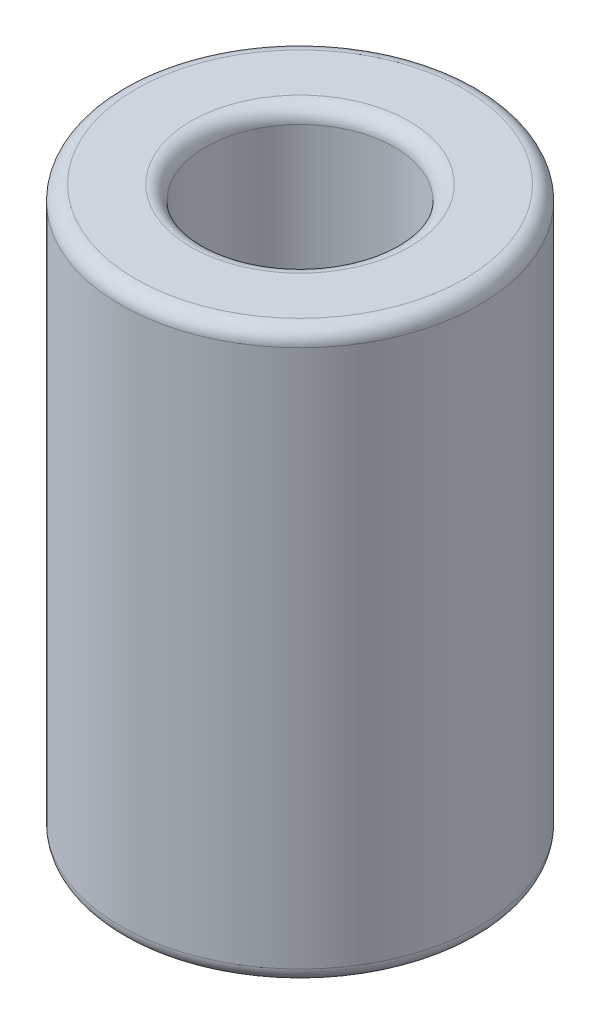
ISO-10303-21;
HEADER;
FILE_DESCRIPTION(('STEP AP214'),'2;1');
FILE_NAME('part.step','',(''),(''),'','','');
FILE_SCHEMA(('AUTOMOTIVE_DESIGN { 1 0 10303 214 1 1 1 1 }'));
ENDSEC;
DATA;
#1=APPLICATION_CONTEXT('core data for automotive mechanical design processes');
#2=APPLICATION_PROTOCOL_DEFINITION('international standard','automotive_design',2000,#1);
#3=PRODUCT_CONTEXT('',#1,'mechanical');
#4=PRODUCT('Part','Part','',(#3));
#5=PRODUCT_RELATED_PRODUCT_CATEGORY('part','',(#4));
#6=PRODUCT_DEFINITION_FORMATION('','',#4);
#7=PRODUCT_DEFINITION_CONTEXT('part definition',#1,'design');
#8=PRODUCT_DEFINITION('design','',#6,#7);
#9=PRODUCT_DEFINITION_SHAPE('','',#8);
#10=(LENGTH_UNIT() NAMED_UNIT(*) SI_UNIT(.MILLI.,.METRE.));
#11=(NAMED_UNIT(*) PLANE_ANGLE_UNIT() SI_UNIT($,.RADIAN.));
#12=(NAMED_UNIT(*) SI_UNIT($,.STERADIAN.) SOLID_ANGLE_UNIT());
#13=UNCERTAINTY_MEASURE_WITH_UNIT(LENGTH_MEASURE(1.E-05),#10,'distance_accuracy_value','');
#14=(GEOMETRIC_REPRESENTATION_CONTEXT(3) GLOBAL_UNCERTAINTY_ASSIGNED_CONTEXT((#13)) GLOBAL_UNIT_ASSIGNED_CONTEXT((#10,
#11,#12)) REPRESENTATION_CONTEXT('',''));
#15=CARTESIAN_POINT('',(0.,0.,0.));
#16=DIRECTION('',(0.,0.,1.));
#17=DIRECTION('',(1.,0.,0.));
#18=AXIS2_PLACEMENT_3D('',#15,#16,#17);
#19=CARTESIAN_POINT('',(0.,19.,0.));
#20=DIRECTION('',(0.,-1.,0.));
#21=DIRECTION('',(0.,0.,-1.));
#22=AXIS2_PLACEMENT_3D('',#19,#20,#21);
#23=CYLINDRICAL_SURFACE('',#22,3.15);
#24=CARTESIAN_POINT('',(0.,18.5,0.));
#25=DIRECTION('',(0.,1.,0.));
#26=DIRECTION('',(0.,0.,1.));
#27=AXIS2_PLACEMENT_3D('',#24,#25,#26);
#28=CIRCLE('',#27,3.15);
#29=CARTESIAN_POINT('',(0.,18.5,3.15));
#30=VERTEX_POINT('',#29);
#31=EDGE_CURVE('E215',#30,#30,#28,.F.);
#32=ORIENTED_EDGE('',*,*,#31,.F.);
#33=EDGE_LOOP('',(#32));
#34=FACE_BOUND('',#33,.T.);
#35=CARTESIAN_POINT('',(0.,0.5,0.));
#36=DIRECTION('',(0.,1.,0.));
#37=DIRECTION('',(0.,0.,1.));
#38=AXIS2_PLACEMENT_3D('',#35,#36,#37);
#39=CIRCLE('',#38,3.15);
#40=CARTESIAN_POINT('',(0.,0.5,3.15));
#41=VERTEX_POINT('',#40);
#42=EDGE_CURVE('E68',#41,#41,#39,.T.);
#43=ORIENTED_EDGE('',*,*,#42,.F.);
#44=EDGE_LOOP('',(#43));
#45=FACE_BOUND('',#44,.T.);
#46=ADVANCED_FACE('F16',(#34,#45),#23,.F.);
#47=CARTESIAN_POINT('',(0.,18.5,0.));
#48=DIRECTION('',(0.,1.,0.));
#49=DIRECTION('',(0.,0.,1.));
#50=AXIS2_PLACEMENT_3D('',#47,#48,#49);
#51=TOROIDAL_SURFACE('',#50,3.65,0.5);
#52=ORIENTED_EDGE('',*,*,#31,.T.);
#53=EDGE_LOOP('',(#52));
#54=FACE_BOUND('',#53,.T.);
#55=CARTESIAN_POINT('',(0.,19.,0.));
#56=DIRECTION('',(0.,1.,0.));
#57=DIRECTION('',(0.,0.,1.));
#58=AXIS2_PLACEMENT_3D('',#55,#56,#57);
#59=CIRCLE('',#58,3.65);
#60=CARTESIAN_POINT('',(0.,19.,-3.65));
#61=VERTEX_POINT('',#60);
#62=CARTESIAN_POINT('',(0.,19.,3.65));
#63=VERTEX_POINT('',#62);
#64=EDGE_CURVE('E57',#61,#63,#59,.F.);
#65=ORIENTED_EDGE('',*,*,#64,.F.);
#66=CARTESIAN_POINT('',(0.,19.,0.));
#67=DIRECTION('',(0.,1.,0.));
#68=DIRECTION('',(0.,0.,-1.));
#69=AXIS2_PLACEMENT_3D('',#66,#67,#68);
#70=CIRCLE('',#69,3.65);
#71=EDGE_CURVE('E55',#63,#61,#70,.F.);
#72=ORIENTED_EDGE('',*,*,#71,.F.);
#73=EDGE_LOOP('',(#65,#72));
#74=FACE_BOUND('',#73,.T.);
#75=ADVANCED_FACE('F59',(#54,#74),#51,.T.);
#76=CARTESIAN_POINT('',(0.,0.5,0.));
#77=DIRECTION('',(0.,1.,0.));
#78=DIRECTION('',(0.,0.,1.));
#79=AXIS2_PLACEMENT_3D('',#76,#77,#78);
#80=TOROIDAL_SURFACE('',#79,3.65,0.5);
#81=CARTESIAN_POINT('',(0.,0.,0.));
#82=DIRECTION('',(0.,-1.,0.));
#83=DIRECTION('',(0.,0.,1.));
#84=AXIS2_PLACEMENT_3D('',#81,#82,#83);
#85=CIRCLE('',#84,3.65);
#86=CARTESIAN_POINT('',(0.,0.,3.65));
#87=VERTEX_POINT('',#86);
#88=CARTESIAN_POINT('',(0.,0.,-3.65));
#89=VERTEX_POINT('',#88);
#90=EDGE_CURVE('E62',#87,#89,#85,.T.);
#91=ORIENTED_EDGE('',*,*,#90,.T.);
#92=CARTESIAN_POINT('',(0.,0.,0.));
#93=DIRECTION('',(0.,-1.,0.));
#94=DIRECTION('',(0.,0.,-1.));
#95=AXIS2_PLACEMENT_3D('',#92,#93,#94);
#96=CIRCLE('',#95,3.65);
#97=EDGE_CURVE('E165',#89,#87,#96,.T.);
#98=ORIENTED_EDGE('',*,*,#97,.T.);
#99=EDGE_LOOP('',(#91,#98));
#100=FACE_BOUND('',#99,.T.);
#101=ORIENTED_EDGE('',*,*,#42,.T.);
#102=EDGE_LOOP('',(#101));
#103=FACE_BOUND('',#102,.T.);
#104=ADVANCED_FACE('F88',(#100,#103),#80,.T.);
#105=CARTESIAN_POINT('',(0.,19.,0.));
#106=DIRECTION('',(0.,1.,0.));
#107=DIRECTION('',(0.,0.,1.));
#108=AXIS2_PLACEMENT_3D('',#105,#106,#107);
#109=PLANE('',#108);
#110=ORIENTED_EDGE('',*,*,#71,.T.);
#111=ORIENTED_EDGE('',*,*,#64,.T.);
#112=EDGE_LOOP('',(#110,#111));
#113=FACE_BOUND('',#112,.T.);
#114=CARTESIAN_POINT('',(0.,19.,0.));
#115=DIRECTION('',(0.,-1.,0.));
#116=DIRECTION('',(0.,0.,-1.));
#117=AXIS2_PLACEMENT_3D('',#114,#115,#116);
#118=CIRCLE('',#117,5.5);
#119=CARTESIAN_POINT('',(0.,19.,-5.5));
#120=VERTEX_POINT('',#119);
#121=CARTESIAN_POINT('',(0.,19.,5.5));
#122=VERTEX_POINT('',#121);
#123=EDGE_CURVE('E112',#120,#122,#118,.T.);
#124=ORIENTED_EDGE('',*,*,#123,.F.);
#125=CARTESIAN_POINT('',(0.,19.,0.));
#126=DIRECTION('',(0.,-1.,0.));
#127=DIRECTION('',(0.,0.,1.));
#128=AXIS2_PLACEMENT_3D('',#125,#126,#127);
#129=CIRCLE('',#128,5.5);
#130=EDGE_CURVE('E183',#122,#120,#129,.T.);
#131=ORIENTED_EDGE('',*,*,#130,.F.);
#132=EDGE_LOOP('',(#124,#131));
#133=FACE_BOUND('',#132,.T.);
#134=ADVANCED_FACE('F66',(#113,#133),#109,.T.);
#135=CARTESIAN_POINT('',(0.,0.,0.));
#136=DIRECTION('',(0.,1.,0.));
#137=DIRECTION('',(0.,0.,1.));
#138=AXIS2_PLACEMENT_3D('',#135,#136,#137);
#139=PLANE('',#138);
#140=ORIENTED_EDGE('',*,*,#90,.F.);
#141=ORIENTED_EDGE('',*,*,#97,.F.);
#142=EDGE_LOOP('',(#140,#141));
#143=FACE_BOUND('',#142,.T.);
#144=CARTESIAN_POINT('',(0.,0.,0.));
#145=DIRECTION('',(0.,1.,0.));
#146=DIRECTION('',(0.,0.,1.));
#147=AXIS2_PLACEMENT_3D('',#144,#145,#146);
#148=CIRCLE('',#147,5.5);
#149=CARTESIAN_POINT('',(0.,0.,5.5));
#150=VERTEX_POINT('',#149);
#151=CARTESIAN_POINT('',(0.,0.,-5.5));
#152=VERTEX_POINT('',#151);
#153=EDGE_CURVE('E135',#150,#152,#148,.T.);
#154=ORIENTED_EDGE('',*,*,#153,.F.);
#155=CARTESIAN_POINT('',(0.,0.,0.));
#156=DIRECTION('',(0.,1.,0.));
#157=DIRECTION('',(0.,0.,-1.));
#158=AXIS2_PLACEMENT_3D('',#155,#156,#157);
#159=CIRCLE('',#158,5.5);
#160=EDGE_CURVE('E34',#152,#150,#159,.T.);
#161=ORIENTED_EDGE('',*,*,#160,.F.);
#162=EDGE_LOOP('',(#154,#161));
#163=FACE_BOUND('',#162,.T.);
#164=ADVANCED_FACE('F87',(#143,#163),#139,.F.);
#165=CARTESIAN_POINT('',(0.,18.5,0.));
#166=DIRECTION('',(0.,1.,0.));
#167=DIRECTION('',(0.,0.,1.));
#168=AXIS2_PLACEMENT_3D('',#165,#166,#167);
#169=TOROIDAL_SURFACE('',#168,5.5,0.5);
#170=ORIENTED_EDGE('',*,*,#130,.T.);
#171=ORIENTED_EDGE('',*,*,#123,.T.);
#172=EDGE_LOOP('',(#170,#171));
#173=FACE_BOUND('',#172,.T.);
#174=CARTESIAN_POINT('',(0.,18.5,0.));
#175=DIRECTION('',(0.,-1.,0.));
#176=DIRECTION('',(0.,0.,-1.));
#177=AXIS2_PLACEMENT_3D('',#174,#175,#176);
#178=CIRCLE('',#177,6.);
#179=CARTESIAN_POINT('',(0.,18.5,-6.));
#180=VERTEX_POINT('',#179);
#181=EDGE_CURVE('E26',#180,#180,#178,.T.);
#182=ORIENTED_EDGE('',*,*,#181,.F.);
#183=EDGE_LOOP('',(#182));
#184=FACE_BOUND('',#183,.T.);
#185=ADVANCED_FACE('F116',(#173,#184),#169,.T.);
#186=CARTESIAN_POINT('',(0.,0.5,0.));
#187=DIRECTION('',(0.,1.,0.));
#188=DIRECTION('',(0.,0.,1.));
#189=AXIS2_PLACEMENT_3D('',#186,#187,#188);
#190=TOROIDAL_SURFACE('',#189,5.5,0.5);
#191=CARTESIAN_POINT('',(0.,0.5,0.));
#192=DIRECTION('',(0.,-1.,0.));
#193=DIRECTION('',(0.,0.,-1.));
#194=AXIS2_PLACEMENT_3D('',#191,#192,#193);
#195=CIRCLE('',#194,6.);
#196=CARTESIAN_POINT('',(0.,0.5,-6.));
#197=VERTEX_POINT('',#196);
#198=EDGE_CURVE('E11',#197,#197,#195,.F.);
#199=ORIENTED_EDGE('',*,*,#198,.F.);
#200=EDGE_LOOP('',(#199));
#201=FACE_BOUND('',#200,.T.);
#202=ORIENTED_EDGE('',*,*,#153,.T.);
#203=ORIENTED_EDGE('',*,*,#160,.T.);
#204=EDGE_LOOP('',(#202,#203));
#205=FACE_BOUND('',#204,.T.);
#206=ADVANCED_FACE('F126',(#201,#205),#190,.T.);
#207=CARTESIAN_POINT('',(0.,19.,0.));
#208=DIRECTION('',(0.,-1.,0.));
#209=DIRECTION('',(0.,0.,-1.));
#210=AXIS2_PLACEMENT_3D('',#207,#208,#209);
#211=CYLINDRICAL_SURFACE('',#210,6.);
#212=ORIENTED_EDGE('',*,*,#198,.T.);
#213=EDGE_LOOP('',(#212));
#214=FACE_BOUND('',#213,.T.);
#215=ORIENTED_EDGE('',*,*,#181,.T.);
#216=EDGE_LOOP('',(#215));
#217=FACE_BOUND('',#216,.T.);
#218=ADVANCED_FACE('F246',(#214,#217),#211,.T.);
#219=CLOSED_SHELL('',(#46,#75,#104,#134,#164,#185,#206,#218));
#220=MANIFOLD_SOLID_BREP('B1',#219);
#221=ADVANCED_BREP_SHAPE_REPRESENTATION('',(#18,#220),#14);
#222=SHAPE_DEFINITION_REPRESENTATION(#9,#221);
ENDSEC;
END-ISO-10303-21;
